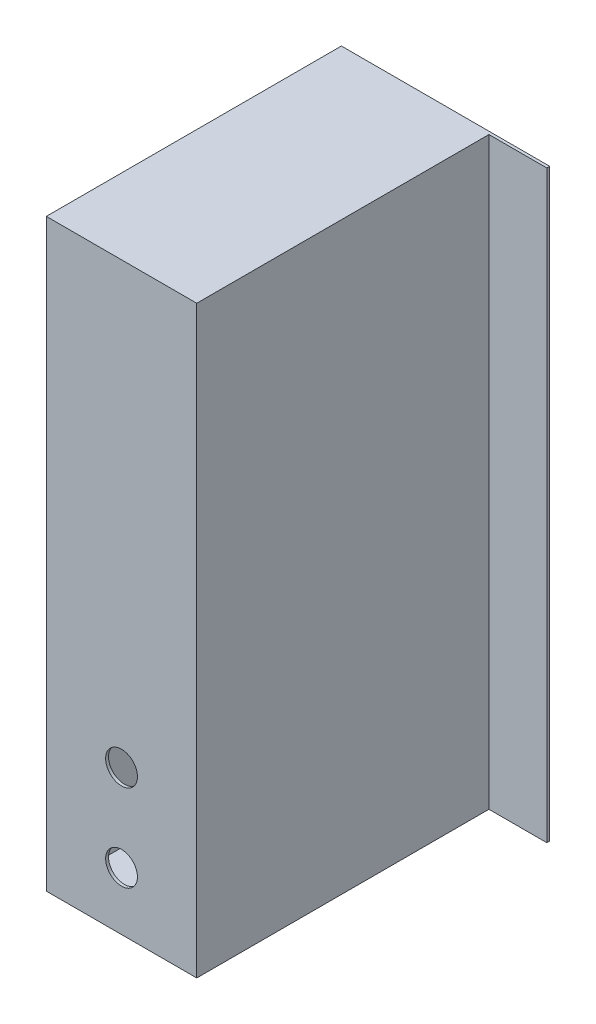
ISO-10303-21;
HEADER;
FILE_DESCRIPTION(('STEP AP214'),'2;1');
FILE_NAME('part.step','',(''),(''),'','','');
FILE_SCHEMA(('AUTOMOTIVE_DESIGN { 1 0 10303 214 1 1 1 1 }'));
ENDSEC;
DATA;
#1=APPLICATION_CONTEXT('core data for automotive mechanical design processes');
#2=APPLICATION_PROTOCOL_DEFINITION('international standard','automotive_design',2000,#1);
#3=PRODUCT_CONTEXT('',#1,'mechanical');
#4=PRODUCT('Part','Part','',(#3));
#5=PRODUCT_RELATED_PRODUCT_CATEGORY('part','',(#4));
#6=PRODUCT_DEFINITION_FORMATION('','',#4);
#7=PRODUCT_DEFINITION_CONTEXT('part definition',#1,'design');
#8=PRODUCT_DEFINITION('design','',#6,#7);
#9=PRODUCT_DEFINITION_SHAPE('','',#8);
#10=(LENGTH_UNIT() NAMED_UNIT(*) SI_UNIT(.MILLI.,.METRE.));
#11=(NAMED_UNIT(*) PLANE_ANGLE_UNIT() SI_UNIT($,.RADIAN.));
#12=(NAMED_UNIT(*) SI_UNIT($,.STERADIAN.) SOLID_ANGLE_UNIT());
#13=UNCERTAINTY_MEASURE_WITH_UNIT(LENGTH_MEASURE(1.E-05),#10,'distance_accuracy_value','');
#14=(GEOMETRIC_REPRESENTATION_CONTEXT(3) GLOBAL_UNCERTAINTY_ASSIGNED_CONTEXT((#13)) GLOBAL_UNIT_ASSIGNED_CONTEXT((#10,
#11,#12)) REPRESENTATION_CONTEXT('',''));
#15=CARTESIAN_POINT('',(0.,0.,0.));
#16=DIRECTION('',(0.,0.,1.));
#17=DIRECTION('',(1.,0.,0.));
#18=AXIS2_PLACEMENT_3D('',#15,#16,#17);
#19=CARTESIAN_POINT('',(26.,-101.,102.));
#20=DIRECTION('',(-1.,0.,0.));
#21=DIRECTION('',(0.,0.,1.));
#22=AXIS2_PLACEMENT_3D('',#19,#20,#21);
#23=PLANE('',#22);
#24=DIRECTION('',(0.,-1.,0.));
#25=VECTOR('',#24,1.);
#26=CARTESIAN_POINT('',(26.,101.,0.999999999999998));
#27=LINE('',#26,#25);
#28=CARTESIAN_POINT('',(26.,101.,0.999999999999987));
#29=VERTEX_POINT('',#28);
#30=CARTESIAN_POINT('',(26.,-101.,0.999999999999973));
#31=VERTEX_POINT('',#30);
#32=EDGE_CURVE('E47',#29,#31,#27,.T.);
#33=ORIENTED_EDGE('',*,*,#32,.F.);
#34=DIRECTION('',(0.,0.,-1.));
#35=VECTOR('',#34,1.);
#36=CARTESIAN_POINT('',(26.,101.,102.));
#37=LINE('',#36,#35);
#38=CARTESIAN_POINT('',(26.,101.,102.));
#39=VERTEX_POINT('',#38);
#40=EDGE_CURVE('E11',#39,#29,#37,.T.);
#41=ORIENTED_EDGE('',*,*,#40,.F.);
#42=DIRECTION('',(0.,1.,0.));
#43=VECTOR('',#42,1.);
#44=CARTESIAN_POINT('',(26.,-101.,102.));
#45=LINE('',#44,#43);
#46=CARTESIAN_POINT('',(26.,-101.,102.));
#47=VERTEX_POINT('',#46);
#48=EDGE_CURVE('E183',#47,#39,#45,.T.);
#49=ORIENTED_EDGE('',*,*,#48,.F.);
#50=DIRECTION('',(0.,0.,-1.));
#51=VECTOR('',#50,1.);
#52=CARTESIAN_POINT('',(26.,-101.,102.));
#53=LINE('',#52,#51);
#54=EDGE_CURVE('E192',#47,#31,#53,.T.);
#55=ORIENTED_EDGE('',*,*,#54,.T.);
#56=EDGE_LOOP('',(#33,#41,#49,#55));
#57=FACE_BOUND('',#56,.T.);
#58=ADVANCED_FACE('F33',(#57),#23,.F.);
#59=CARTESIAN_POINT('',(0.,0.,102.));
#60=DIRECTION('',(0.,0.,-1.));
#61=DIRECTION('',(-1.,0.,0.));
#62=AXIS2_PLACEMENT_3D('',#59,#60,#61);
#63=PLANE('',#62);
#64=CARTESIAN_POINT('',(0.,-51.,102.));
#65=DIRECTION('',(0.,0.,1.));
#66=DIRECTION('',(1.,0.,0.));
#67=AXIS2_PLACEMENT_3D('',#64,#65,#66);
#68=CIRCLE('',#67,5.5);
#69=CARTESIAN_POINT('',(5.5,-51.,102.));
#70=VERTEX_POINT('',#69);
#71=EDGE_CURVE('E144',#70,#70,#68,.T.);
#72=ORIENTED_EDGE('',*,*,#71,.F.);
#73=EDGE_LOOP('',(#72));
#74=FACE_BOUND('',#73,.T.);
#75=CARTESIAN_POINT('',(0.,-81.,102.));
#76=DIRECTION('',(0.,0.,1.));
#77=DIRECTION('',(1.,0.,0.));
#78=AXIS2_PLACEMENT_3D('',#75,#76,#77);
#79=CIRCLE('',#78,5.5);
#80=CARTESIAN_POINT('',(5.5,-81.,102.));
#81=VERTEX_POINT('',#80);
#82=EDGE_CURVE('E148',#81,#81,#79,.T.);
#83=ORIENTED_EDGE('',*,*,#82,.F.);
#84=EDGE_LOOP('',(#83));
#85=FACE_BOUND('',#84,.T.);
#86=ORIENTED_EDGE('',*,*,#48,.T.);
#87=DIRECTION('',(-1.,0.,0.));
#88=VECTOR('',#87,1.);
#89=CARTESIAN_POINT('',(-26.,101.,102.));
#90=LINE('',#89,#88);
#91=CARTESIAN_POINT('',(-26.,101.,102.));
#92=VERTEX_POINT('',#91);
#93=EDGE_CURVE('E186',#39,#92,#90,.T.);
#94=ORIENTED_EDGE('',*,*,#93,.T.);
#95=DIRECTION('',(0.,-1.,0.));
#96=VECTOR('',#95,1.);
#97=CARTESIAN_POINT('',(-26.,-101.,102.));
#98=LINE('',#97,#96);
#99=CARTESIAN_POINT('',(-26.,-101.,102.));
#100=VERTEX_POINT('',#99);
#101=EDGE_CURVE('E189',#92,#100,#98,.T.);
#102=ORIENTED_EDGE('',*,*,#101,.T.);
#103=DIRECTION('',(1.,0.,0.));
#104=VECTOR('',#103,1.);
#105=CARTESIAN_POINT('',(-26.,-101.,102.));
#106=LINE('',#105,#104);
#107=EDGE_CURVE('E191',#100,#47,#106,.T.);
#108=ORIENTED_EDGE('',*,*,#107,.T.);
#109=EDGE_LOOP('',(#86,#94,#102,#108));
#110=FACE_BOUND('',#109,.T.);
#111=ADVANCED_FACE('F205',(#74,#85,#110),#63,.F.);
#112=CARTESIAN_POINT('',(-26.,101.,102.));
#113=DIRECTION('',(0.,-1.,0.));
#114=DIRECTION('',(0.,0.,-1.));
#115=AXIS2_PLACEMENT_3D('',#112,#113,#114);
#116=PLANE('',#115);
#117=DIRECTION('',(-1.,0.,0.));
#118=VECTOR('',#117,1.);
#119=CARTESIAN_POINT('',(-26.,101.,0.));
#120=LINE('',#119,#118);
#121=CARTESIAN_POINT('',(46.,101.,0.));
#122=VERTEX_POINT('',#121);
#123=CARTESIAN_POINT('',(-26.,101.,0.));
#124=VERTEX_POINT('',#123);
#125=EDGE_CURVE('E110',#122,#124,#120,.T.);
#126=ORIENTED_EDGE('',*,*,#125,.T.);
#127=DIRECTION('',(0.,0.,-1.));
#128=VECTOR('',#127,1.);
#129=CARTESIAN_POINT('',(-26.,101.,102.));
#130=LINE('',#129,#128);
#131=EDGE_CURVE('E40',#92,#124,#130,.T.);
#132=ORIENTED_EDGE('',*,*,#131,.F.);
#133=ORIENTED_EDGE('',*,*,#93,.F.);
#134=ORIENTED_EDGE('',*,*,#40,.T.);
#135=DIRECTION('',(-1.,0.,0.));
#136=VECTOR('',#135,1.);
#137=CARTESIAN_POINT('',(46.,101.,0.999999999999998));
#138=LINE('',#137,#136);
#139=CARTESIAN_POINT('',(46.,101.,0.999999999999998));
#140=VERTEX_POINT('',#139);
#141=EDGE_CURVE('E126',#140,#29,#138,.T.);
#142=ORIENTED_EDGE('',*,*,#141,.F.);
#143=DIRECTION('',(0.,0.,1.));
#144=VECTOR('',#143,1.);
#145=CARTESIAN_POINT('',(46.,101.,0.));
#146=LINE('',#145,#144);
#147=EDGE_CURVE('E123',#122,#140,#146,.T.);
#148=ORIENTED_EDGE('',*,*,#147,.F.);
#149=EDGE_LOOP('',(#126,#132,#133,#134,#142,#148));
#150=FACE_BOUND('',#149,.T.);
#151=ADVANCED_FACE('F124',(#150),#116,.F.);
#152=CARTESIAN_POINT('',(-26.,-101.,102.));
#153=DIRECTION('',(1.,0.,0.));
#154=DIRECTION('',(0.,0.,-1.));
#155=AXIS2_PLACEMENT_3D('',#152,#153,#154);
#156=PLANE('',#155);
#157=DIRECTION('',(0.,-1.,0.));
#158=VECTOR('',#157,1.);
#159=CARTESIAN_POINT('',(-26.,-101.,0.));
#160=LINE('',#159,#158);
#161=CARTESIAN_POINT('',(-26.,-101.,0.));
#162=VERTEX_POINT('',#161);
#163=EDGE_CURVE('E116',#124,#162,#160,.T.);
#164=ORIENTED_EDGE('',*,*,#163,.T.);
#165=DIRECTION('',(0.,0.,-1.));
#166=VECTOR('',#165,1.);
#167=CARTESIAN_POINT('',(-26.,-101.,102.));
#168=LINE('',#167,#166);
#169=EDGE_CURVE('E197',#100,#162,#168,.T.);
#170=ORIENTED_EDGE('',*,*,#169,.F.);
#171=ORIENTED_EDGE('',*,*,#101,.F.);
#172=ORIENTED_EDGE('',*,*,#131,.T.);
#173=EDGE_LOOP('',(#164,#170,#171,#172));
#174=FACE_BOUND('',#173,.T.);
#175=ADVANCED_FACE('F201',(#174),#156,.F.);
#176=CARTESIAN_POINT('',(-26.,-101.,102.));
#177=DIRECTION('',(0.,1.,0.));
#178=DIRECTION('',(0.,0.,1.));
#179=AXIS2_PLACEMENT_3D('',#176,#177,#178);
#180=PLANE('',#179);
#181=DIRECTION('',(1.,0.,0.));
#182=VECTOR('',#181,1.);
#183=CARTESIAN_POINT('',(-26.,-101.,0.));
#184=LINE('',#183,#182);
#185=CARTESIAN_POINT('',(46.,-101.,0.));
#186=VERTEX_POINT('',#185);
#187=EDGE_CURVE('E187',#162,#186,#184,.T.);
#188=ORIENTED_EDGE('',*,*,#187,.T.);
#189=DIRECTION('',(0.,0.,-1.));
#190=VECTOR('',#189,1.);
#191=CARTESIAN_POINT('',(46.,-101.,0.));
#192=LINE('',#191,#190);
#193=CARTESIAN_POINT('',(46.,-101.,0.999999999999973));
#194=VERTEX_POINT('',#193);
#195=EDGE_CURVE('E134',#194,#186,#192,.T.);
#196=ORIENTED_EDGE('',*,*,#195,.F.);
#197=DIRECTION('',(-1.,0.,0.));
#198=VECTOR('',#197,1.);
#199=CARTESIAN_POINT('',(46.,-101.,0.999999999999973));
#200=LINE('',#199,#198);
#201=EDGE_CURVE('E139',#194,#31,#200,.T.);
#202=ORIENTED_EDGE('',*,*,#201,.T.);
#203=ORIENTED_EDGE('',*,*,#54,.F.);
#204=ORIENTED_EDGE('',*,*,#107,.F.);
#205=ORIENTED_EDGE('',*,*,#169,.T.);
#206=EDGE_LOOP('',(#188,#196,#202,#203,#204,#205));
#207=FACE_BOUND('',#206,.T.);
#208=ADVANCED_FACE('F229',(#207),#180,.F.);
#209=CARTESIAN_POINT('',(0.,0.,0.));
#210=DIRECTION('',(0.,0.,-1.));
#211=DIRECTION('',(-1.,0.,0.));
#212=AXIS2_PLACEMENT_3D('',#209,#210,#211);
#213=PLANE('',#212);
#214=ORIENTED_EDGE('',*,*,#125,.F.);
#215=DIRECTION('',(0.,1.,0.));
#216=VECTOR('',#215,1.);
#217=CARTESIAN_POINT('',(46.,101.,0.));
#218=LINE('',#217,#216);
#219=EDGE_CURVE('E115',#186,#122,#218,.T.);
#220=ORIENTED_EDGE('',*,*,#219,.F.);
#221=ORIENTED_EDGE('',*,*,#187,.F.);
#222=ORIENTED_EDGE('',*,*,#163,.F.);
#223=EDGE_LOOP('',(#214,#220,#221,#222));
#224=FACE_BOUND('',#223,.T.);
#225=ADVANCED_FACE('F112',(#224),#213,.T.);
#226=CARTESIAN_POINT('',(0.,-81.,101.));
#227=DIRECTION('',(0.,0.,1.));
#228=DIRECTION('',(1.,0.,0.));
#229=AXIS2_PLACEMENT_3D('',#226,#227,#228);
#230=CYLINDRICAL_SURFACE('',#229,5.5);
#231=CARTESIAN_POINT('',(0.,-81.,101.));
#232=DIRECTION('',(0.,0.,1.));
#233=DIRECTION('',(1.,0.,0.));
#234=AXIS2_PLACEMENT_3D('',#231,#232,#233);
#235=CIRCLE('',#234,5.5);
#236=CARTESIAN_POINT('',(5.5,-81.,101.));
#237=VERTEX_POINT('',#236);
#238=EDGE_CURVE('E151',#237,#237,#235,.T.);
#239=ORIENTED_EDGE('',*,*,#238,.F.);
#240=EDGE_LOOP('',(#239));
#241=FACE_BOUND('',#240,.T.);
#242=ORIENTED_EDGE('',*,*,#82,.T.);
#243=EDGE_LOOP('',(#242));
#244=FACE_BOUND('',#243,.T.);
#245=ADVANCED_FACE('F228',(#241,#244),#230,.F.);
#246=CARTESIAN_POINT('',(0.,0.,101.));
#247=DIRECTION('',(0.,0.,-1.));
#248=DIRECTION('',(-1.,0.,0.));
#249=AXIS2_PLACEMENT_3D('',#246,#247,#248);
#250=PLANE('',#249);
#251=CARTESIAN_POINT('',(0.,-51.,101.));
#252=DIRECTION('',(0.,0.,1.));
#253=DIRECTION('',(1.,0.,0.));
#254=AXIS2_PLACEMENT_3D('',#251,#252,#253);
#255=CIRCLE('',#254,5.5);
#256=CARTESIAN_POINT('',(5.5,-51.,101.));
#257=VERTEX_POINT('',#256);
#258=EDGE_CURVE('E145',#257,#257,#255,.T.);
#259=ORIENTED_EDGE('',*,*,#258,.T.);
#260=EDGE_LOOP('',(#259));
#261=FACE_BOUND('',#260,.T.);
#262=ORIENTED_EDGE('',*,*,#238,.T.);
#263=EDGE_LOOP('',(#262));
#264=FACE_BOUND('',#263,.T.);
#265=DIRECTION('',(0.,1.,0.));
#266=VECTOR('',#265,1.);
#267=CARTESIAN_POINT('',(25.,-100.,101.));
#268=LINE('',#267,#266);
#269=CARTESIAN_POINT('',(25.,-100.,101.));
#270=VERTEX_POINT('',#269);
#271=CARTESIAN_POINT('',(25.,100.,101.));
#272=VERTEX_POINT('',#271);
#273=EDGE_CURVE('E54',#270,#272,#268,.T.);
#274=ORIENTED_EDGE('',*,*,#273,.F.);
#275=DIRECTION('',(1.,0.,0.));
#276=VECTOR('',#275,1.);
#277=CARTESIAN_POINT('',(-25.,-100.,101.));
#278=LINE('',#277,#276);
#279=CARTESIAN_POINT('',(-25.,-100.,101.));
#280=VERTEX_POINT('',#279);
#281=EDGE_CURVE('E162',#280,#270,#278,.T.);
#282=ORIENTED_EDGE('',*,*,#281,.F.);
#283=DIRECTION('',(0.,-1.,0.));
#284=VECTOR('',#283,1.);
#285=CARTESIAN_POINT('',(-25.,-100.,101.));
#286=LINE('',#285,#284);
#287=CARTESIAN_POINT('',(-25.,100.,101.));
#288=VERTEX_POINT('',#287);
#289=EDGE_CURVE('E159',#288,#280,#286,.T.);
#290=ORIENTED_EDGE('',*,*,#289,.F.);
#291=DIRECTION('',(-1.,0.,0.));
#292=VECTOR('',#291,1.);
#293=CARTESIAN_POINT('',(-25.,100.,101.));
#294=LINE('',#293,#292);
#295=EDGE_CURVE('E157',#272,#288,#294,.T.);
#296=ORIENTED_EDGE('',*,*,#295,.F.);
#297=EDGE_LOOP('',(#274,#282,#290,#296));
#298=FACE_BOUND('',#297,.T.);
#299=ADVANCED_FACE('F242',(#261,#264,#298),#250,.T.);
#300=CARTESIAN_POINT('',(0.,0.,1.));
#301=DIRECTION('',(0.,0.,-1.));
#302=DIRECTION('',(-1.,0.,0.));
#303=AXIS2_PLACEMENT_3D('',#300,#301,#302);
#304=PLANE('',#303);
#305=DIRECTION('',(0.,1.,0.));
#306=VECTOR('',#305,1.);
#307=CARTESIAN_POINT('',(25.,0.,1.));
#308=LINE('',#307,#306);
#309=CARTESIAN_POINT('',(25.,-100.,1.));
#310=VERTEX_POINT('',#309);
#311=CARTESIAN_POINT('',(25.,100.,1.));
#312=VERTEX_POINT('',#311);
#313=EDGE_CURVE('E164',#310,#312,#308,.T.);
#314=ORIENTED_EDGE('',*,*,#313,.T.);
#315=DIRECTION('',(-1.,0.,0.));
#316=VECTOR('',#315,1.);
#317=CARTESIAN_POINT('',(0.,100.,1.));
#318=LINE('',#317,#316);
#319=CARTESIAN_POINT('',(-25.,100.,1.));
#320=VERTEX_POINT('',#319);
#321=EDGE_CURVE('E167',#312,#320,#318,.T.);
#322=ORIENTED_EDGE('',*,*,#321,.T.);
#323=DIRECTION('',(0.,-1.,0.));
#324=VECTOR('',#323,1.);
#325=CARTESIAN_POINT('',(-25.,0.,1.));
#326=LINE('',#325,#324);
#327=CARTESIAN_POINT('',(-25.,-100.,1.));
#328=VERTEX_POINT('',#327);
#329=EDGE_CURVE('E176',#320,#328,#326,.T.);
#330=ORIENTED_EDGE('',*,*,#329,.T.);
#331=DIRECTION('',(1.,0.,0.));
#332=VECTOR('',#331,1.);
#333=CARTESIAN_POINT('',(0.,-100.,1.));
#334=LINE('',#333,#332);
#335=EDGE_CURVE('E173',#328,#310,#334,.T.);
#336=ORIENTED_EDGE('',*,*,#335,.T.);
#337=EDGE_LOOP('',(#314,#322,#330,#336));
#338=FACE_BOUND('',#337,.T.);
#339=ADVANCED_FACE('F224',(#338),#304,.F.);
#340=CARTESIAN_POINT('',(-26.,-100.,102.));
#341=DIRECTION('',(0.,1.,0.));
#342=DIRECTION('',(0.,0.,1.));
#343=AXIS2_PLACEMENT_3D('',#340,#341,#342);
#344=PLANE('',#343);
#345=ORIENTED_EDGE('',*,*,#281,.T.);
#346=DIRECTION('',(0.,0.,-1.));
#347=VECTOR('',#346,1.);
#348=CARTESIAN_POINT('',(25.,-100.,102.));
#349=LINE('',#348,#347);
#350=EDGE_CURVE('E170',#270,#310,#349,.T.);
#351=ORIENTED_EDGE('',*,*,#350,.T.);
#352=ORIENTED_EDGE('',*,*,#335,.F.);
#353=DIRECTION('',(0.,0.,-1.));
#354=VECTOR('',#353,1.);
#355=CARTESIAN_POINT('',(-25.,-100.,102.));
#356=LINE('',#355,#354);
#357=EDGE_CURVE('E172',#280,#328,#356,.T.);
#358=ORIENTED_EDGE('',*,*,#357,.F.);
#359=EDGE_LOOP('',(#345,#351,#352,#358));
#360=FACE_BOUND('',#359,.T.);
#361=ADVANCED_FACE('F256',(#360),#344,.T.);
#362=CARTESIAN_POINT('',(-25.,-101.,102.));
#363=DIRECTION('',(1.,0.,0.));
#364=DIRECTION('',(0.,0.,-1.));
#365=AXIS2_PLACEMENT_3D('',#362,#363,#364);
#366=PLANE('',#365);
#367=ORIENTED_EDGE('',*,*,#289,.T.);
#368=ORIENTED_EDGE('',*,*,#357,.T.);
#369=ORIENTED_EDGE('',*,*,#329,.F.);
#370=DIRECTION('',(0.,0.,-1.));
#371=VECTOR('',#370,1.);
#372=CARTESIAN_POINT('',(-25.,100.,102.));
#373=LINE('',#372,#371);
#374=EDGE_CURVE('E169',#288,#320,#373,.T.);
#375=ORIENTED_EDGE('',*,*,#374,.F.);
#376=EDGE_LOOP('',(#367,#368,#369,#375));
#377=FACE_BOUND('',#376,.T.);
#378=ADVANCED_FACE('F263',(#377),#366,.T.);
#379=CARTESIAN_POINT('',(-26.,100.,102.));
#380=DIRECTION('',(0.,-1.,0.));
#381=DIRECTION('',(0.,0.,-1.));
#382=AXIS2_PLACEMENT_3D('',#379,#380,#381);
#383=PLANE('',#382);
#384=ORIENTED_EDGE('',*,*,#295,.T.);
#385=ORIENTED_EDGE('',*,*,#374,.T.);
#386=ORIENTED_EDGE('',*,*,#321,.F.);
#387=DIRECTION('',(0.,0.,-1.));
#388=VECTOR('',#387,1.);
#389=CARTESIAN_POINT('',(25.,100.,102.));
#390=LINE('',#389,#388);
#391=EDGE_CURVE('E120',#272,#312,#390,.T.);
#392=ORIENTED_EDGE('',*,*,#391,.F.);
#393=EDGE_LOOP('',(#384,#385,#386,#392));
#394=FACE_BOUND('',#393,.T.);
#395=ADVANCED_FACE('F270',(#394),#383,.T.);
#396=CARTESIAN_POINT('',(25.,-101.,102.));
#397=DIRECTION('',(-1.,0.,0.));
#398=DIRECTION('',(0.,0.,1.));
#399=AXIS2_PLACEMENT_3D('',#396,#397,#398);
#400=PLANE('',#399);
#401=ORIENTED_EDGE('',*,*,#273,.T.);
#402=ORIENTED_EDGE('',*,*,#391,.T.);
#403=ORIENTED_EDGE('',*,*,#313,.F.);
#404=ORIENTED_EDGE('',*,*,#350,.F.);
#405=EDGE_LOOP('',(#401,#402,#403,#404));
#406=FACE_BOUND('',#405,.T.);
#407=ADVANCED_FACE('F278',(#406),#400,.T.);
#408=CARTESIAN_POINT('',(0.,-51.,101.));
#409=DIRECTION('',(0.,0.,1.));
#410=DIRECTION('',(1.,0.,0.));
#411=AXIS2_PLACEMENT_3D('',#408,#409,#410);
#412=CYLINDRICAL_SURFACE('',#411,5.5);
#413=ORIENTED_EDGE('',*,*,#258,.F.);
#414=EDGE_LOOP('',(#413));
#415=FACE_BOUND('',#414,.T.);
#416=ORIENTED_EDGE('',*,*,#71,.T.);
#417=EDGE_LOOP('',(#416));
#418=FACE_BOUND('',#417,.T.);
#419=ADVANCED_FACE('F286',(#415,#418),#412,.F.);
#420=CARTESIAN_POINT('',(46.,101.,0.999999999999998));
#421=DIRECTION('',(0.,0.,-1.));
#422=DIRECTION('',(0.,1.,0.));
#423=AXIS2_PLACEMENT_3D('',#420,#421,#422);
#424=PLANE('',#423);
#425=ORIENTED_EDGE('',*,*,#32,.T.);
#426=ORIENTED_EDGE('',*,*,#201,.F.);
#427=DIRECTION('',(0.,-1.,0.));
#428=VECTOR('',#427,1.);
#429=CARTESIAN_POINT('',(46.,101.,0.999999999999998));
#430=LINE('',#429,#428);
#431=EDGE_CURVE('E129',#140,#194,#430,.T.);
#432=ORIENTED_EDGE('',*,*,#431,.F.);
#433=ORIENTED_EDGE('',*,*,#141,.T.);
#434=EDGE_LOOP('',(#425,#426,#432,#433));
#435=FACE_BOUND('',#434,.T.);
#436=ADVANCED_FACE('F292',(#435),#424,.F.);
#437=CARTESIAN_POINT('',(46.,0.,0.));
#438=DIRECTION('',(-1.,0.,0.));
#439=DIRECTION('',(0.,0.,1.));
#440=AXIS2_PLACEMENT_3D('',#437,#438,#439);
#441=PLANE('',#440);
#442=ORIENTED_EDGE('',*,*,#219,.T.);
#443=ORIENTED_EDGE('',*,*,#147,.T.);
#444=ORIENTED_EDGE('',*,*,#431,.T.);
#445=ORIENTED_EDGE('',*,*,#195,.T.);
#446=EDGE_LOOP('',(#442,#443,#444,#445));
#447=FACE_BOUND('',#446,.T.);
#448=ADVANCED_FACE('F132',(#447),#441,.F.);
#449=CLOSED_SHELL('',(#58,#111,#151,#175,#208,#225,#245,#299,#339,#361,#378,#395,#407,#419,#436,#448));
#450=MANIFOLD_SOLID_BREP('B2',#449);
#451=ADVANCED_BREP_SHAPE_REPRESENTATION('',(#18,#450),#14);
#452=SHAPE_DEFINITION_REPRESENTATION(#9,#451);
ENDSEC;
END-ISO-10303-21;
